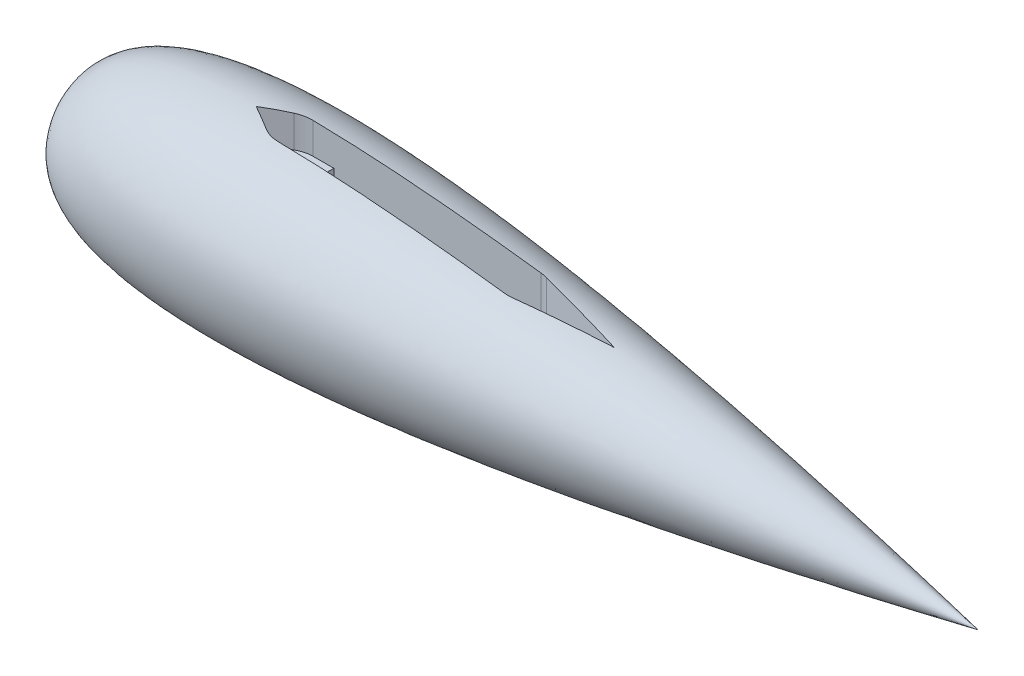
ISO-10303-21;
HEADER;
FILE_DESCRIPTION(('STEP AP214'),'2;1');
FILE_NAME('part.step','',(''),(''),'','','');
FILE_SCHEMA(('AUTOMOTIVE_DESIGN { 1 0 10303 214 1 1 1 1 }'));
ENDSEC;
DATA;
#1=APPLICATION_CONTEXT('core data for automotive mechanical design processes');
#2=APPLICATION_PROTOCOL_DEFINITION('international standard','automotive_design',2000,#1);
#3=PRODUCT_CONTEXT('',#1,'mechanical');
#4=PRODUCT('Part','Part','',(#3));
#5=PRODUCT_RELATED_PRODUCT_CATEGORY('part','',(#4));
#6=PRODUCT_DEFINITION_FORMATION('','',#4);
#7=PRODUCT_DEFINITION_CONTEXT('part definition',#1,'design');
#8=PRODUCT_DEFINITION('design','',#6,#7);
#9=PRODUCT_DEFINITION_SHAPE('','',#8);
#10=(LENGTH_UNIT() NAMED_UNIT(*) SI_UNIT(.MILLI.,.METRE.));
#11=(NAMED_UNIT(*) PLANE_ANGLE_UNIT() SI_UNIT($,.RADIAN.));
#12=(NAMED_UNIT(*) SI_UNIT($,.STERADIAN.) SOLID_ANGLE_UNIT());
#13=UNCERTAINTY_MEASURE_WITH_UNIT(LENGTH_MEASURE(1.E-05),#10,'distance_accuracy_value','');
#14=(GEOMETRIC_REPRESENTATION_CONTEXT(3) GLOBAL_UNCERTAINTY_ASSIGNED_CONTEXT((#13)) GLOBAL_UNIT_ASSIGNED_CONTEXT((#10,
#11,#12)) REPRESENTATION_CONTEXT('',''));
#15=CARTESIAN_POINT('',(0.,0.,0.));
#16=DIRECTION('',(0.,0.,1.));
#17=DIRECTION('',(1.,0.,0.));
#18=AXIS2_PLACEMENT_3D('',#15,#16,#17);
#19=CARTESIAN_POINT('',(55.6564205666341,0.,0.));
#20=CARTESIAN_POINT('',(-94.3435794333659,29.0957116563533,0.));
#21=CARTESIAN_POINT('',(-94.3435794333659,10.223622887628,0.));
#22=CARTESIAN_POINT('',(-94.3435794333659,0.,0.));
#23=B_SPLINE_CURVE_WITH_KNOTS('',3,(#19,#20,#21,#22),.UNSPECIFIED.,.F.,.F.,(4,4),(0.,1.),.UNSPECIFIED.);
#24=CARTESIAN_POINT('',(-94.3435794333659,0.,0.));
#25=DIRECTION('',(-1.,0.,0.));
#26=AXIS1_PLACEMENT('',#24,#25);
#27=SURFACE_OF_REVOLUTION('',#23,#26);
#28=CARTESIAN_POINT('',(-65.2373916220375,15.4666818521613,0.));
#29=CARTESIAN_POINT('',(-65.0690509804965,15.4709053824852,0.0971915147092756));
#30=CARTESIAN_POINT('',(-64.9006877576788,15.4739192362829,0.194396066724708));
#31=CARTESIAN_POINT('',(-64.5640175159769,15.4775415760858,0.388772721399423));
#32=CARTESIAN_POINT('',(-64.3957105058185,15.4781511419781,0.485944819020868));
#33=CARTESIAN_POINT('',(-64.0591527461173,15.4769828320744,0.680256532182195));
#34=CARTESIAN_POINT('',(-63.8909019947082,15.475205665124,0.777396148799607));
#35=CARTESIAN_POINT('',(-63.5544566714715,15.4692774266519,0.971642946737914));
#36=CARTESIAN_POINT('',(-63.3862620950196,15.4651267047136,1.06875013072865));
#37=CARTESIAN_POINT('',(-63.0499298127876,15.4544614114961,1.26293166441246));
#38=CARTESIAN_POINT('',(-62.8817921067995,15.4479468489571,1.36000601422561));
#39=CARTESIAN_POINT('',(-62.5455723394431,15.432560165854,1.55412258741567));
#40=CARTESIAN_POINT('',(-62.3774902902281,15.4236876912814,1.6511648037759));
#41=CARTESIAN_POINT('',(-62.0413816848923,15.4035880418934,1.84521719754349));
#42=CARTESIAN_POINT('',(-61.8733551601594,15.3923601673027,1.94222735682901));
#43=CARTESIAN_POINT('',(-61.5373576375626,15.3675483800647,2.13621561694731));
#44=CARTESIAN_POINT('',(-61.3693866975708,15.353963422472,2.23319368436761));
#45=CARTESIAN_POINT('',(-61.2014932371752,15.339203451421,2.33012701892221));
#46=B_SPLINE_CURVE_WITH_KNOTS('',3,(#28,#29,#30,#31,#32,#33,#34,#35,#36,#37,#38,#39,#40,#41,#42,
#43,#44,#45),.UNSPECIFIED.,.F.,.F.,(4,2,2,2,2,2,2,2,4),(0.,0.583282651433663,1.16630329134126,
1.74915081583197,2.33191251911513,2.9146720677068,3.4975191591856,4.08053965686277,
4.66381928350256),.UNSPECIFIED.);
#47=CARTESIAN_POINT('',(-65.2373916220375,15.4666818521613,0.));
#48=VERTEX_POINT('',#47);
#49=CARTESIAN_POINT('',(-61.2014932371752,15.339203451421,2.33012701892221));
#50=VERTEX_POINT('',#49);
#51=EDGE_CURVE('E178',#48,#50,#46,.T.);
#52=ORIENTED_EDGE('',*,*,#51,.F.);
#53=CARTESIAN_POINT('',(-65.2373916220375,15.4666818521613,0.));
#54=CARTESIAN_POINT('',(-65.0690509804965,15.4709053824852,-0.0971915147092773));
#55=CARTESIAN_POINT('',(-64.9006877576788,15.4739192362829,-0.19439606672471));
#56=CARTESIAN_POINT('',(-64.5640175159769,15.4775415760858,-0.388772721399423));
#57=CARTESIAN_POINT('',(-64.3957105058185,15.4781511419781,-0.485944819020869));
#58=CARTESIAN_POINT('',(-64.0591527461173,15.4769828320744,-0.680256532182196));
#59=CARTESIAN_POINT('',(-63.8909019947082,15.475205665124,-0.777396148799607));
#60=CARTESIAN_POINT('',(-63.5544566714715,15.4692774266519,-0.971642946737915));
#61=CARTESIAN_POINT('',(-63.3862620950196,15.4651267047136,-1.06875013072865));
#62=CARTESIAN_POINT('',(-63.0499298127876,15.4544614114961,-1.26293166441246));
#63=CARTESIAN_POINT('',(-62.8817921067995,15.4479468489571,-1.36000601422561));
#64=CARTESIAN_POINT('',(-62.5455723394431,15.432560165854,-1.55412258741568));
#65=CARTESIAN_POINT('',(-62.3774902902281,15.4236876912814,-1.6511648037759));
#66=CARTESIAN_POINT('',(-62.0413816848923,15.4035880418934,-1.8452171975435));
#67=CARTESIAN_POINT('',(-61.8733551601594,15.3923601673027,-1.94222735682902));
#68=CARTESIAN_POINT('',(-61.5373576375626,15.3675483800647,-2.13621561694732));
#69=CARTESIAN_POINT('',(-61.3693866975708,15.353963422472,-2.23319368436762));
#70=CARTESIAN_POINT('',(-61.2014932371752,15.339203451421,-2.33012701892222));
#71=B_SPLINE_CURVE_WITH_KNOTS('',3,(#53,#54,#55,#56,#57,#58,#59,#60,#61,#62,#63,#64,#65,#66,#67,
#68,#69,#70),.UNSPECIFIED.,.F.,.F.,(4,2,2,2,2,2,2,2,4),(0.,0.583282651433662,1.16630329134125,
1.74915081583196,2.33191251911513,2.9146720677068,3.4975191591856,4.08053965686277,
4.66381928350256),.UNSPECIFIED.);
#72=CARTESIAN_POINT('',(-61.2014932371752,15.339203451421,-2.33012701892221));
#73=VERTEX_POINT('',#72);
#74=EDGE_CURVE('E11',#48,#73,#71,.T.);
#75=ORIENTED_EDGE('',*,*,#74,.T.);
#76=CARTESIAN_POINT('',(-61.2014932371752,15.339203451421,-2.33012701892221));
#77=CARTESIAN_POINT('',(-61.0793496460925,15.3284560416102,-2.40066262383545));
#78=CARTESIAN_POINT('',(-60.9541949867266,15.3178823924373,-2.46601366170608));
#79=CARTESIAN_POINT('',(-60.6987169665933,15.2974942002791,-2.58595482031964));
#80=CARTESIAN_POINT('',(-60.5683917647922,15.2876799314173,-2.64054106606606));
#81=CARTESIAN_POINT('',(-60.306391933304,15.2694307817743,-2.73744555706165));
#82=CARTESIAN_POINT('',(-60.174808106324,15.2609705691354,-2.78000452746559));
#83=CARTESIAN_POINT('',(-59.908547977557,15.2454989264825,-2.85408176842758));
#84=CARTESIAN_POINT('',(-59.7738730084066,15.238486884708,-2.88560470493815));
#85=CARTESIAN_POINT('',(-59.4848765656973,15.2253794755396,-2.94070955522845));
#86=CARTESIAN_POINT('',(-59.330249293477,15.2195167732993,-2.9627559159899));
#87=CARTESIAN_POINT('',(-59.0175976120412,15.2101216169428,-2.9925062303323));
#88=CARTESIAN_POINT('',(-58.859554902197,15.2066192231815,-3.00002736162957));
#89=CARTESIAN_POINT('',(-58.7014932371752,15.20445396479,-3.));
#90=B_SPLINE_CURVE_WITH_KNOTS('',3,(#76,#77,#78,#79,#80,#81,#82,#83,#84,#85,#86,#87,#88,#89),
.UNSPECIFIED.,.F.,.F.,(4,2,2,2,2,2,4),(0.,0.424245987886247,0.848644413730668,1.26382423233642,
1.67882830343421,2.14702105168672,2.62106927269348),.UNSPECIFIED.);
#91=CARTESIAN_POINT('',(-58.7014932371752,15.20445396479,-3.));
#92=VERTEX_POINT('',#91);
#93=EDGE_CURVE('E46',#73,#92,#90,.T.);
#94=ORIENTED_EDGE('',*,*,#93,.T.);
#95=CARTESIAN_POINT('',(-58.7014932371752,15.20445396479,-3.));
#96=CARTESIAN_POINT('',(-58.0870352920107,15.1959248918525,-3.));
#97=CARTESIAN_POINT('',(-57.4726217185503,15.1844913130048,-3.));
#98=CARTESIAN_POINT('',(-56.2439262759059,15.1562159738541,-3.));
#99=CARTESIAN_POINT('',(-55.6296444051429,15.13937428249,-3.));
#100=CARTESIAN_POINT('',(-54.401413902033,15.1006887988245,-3.));
#101=CARTESIAN_POINT('',(-53.7874652245871,15.0788464268982,-3.));
#102=CARTESIAN_POINT('',(-52.5597508867958,15.0304974135428,-3.));
#103=CARTESIAN_POINT('',(-51.9459852271191,15.0039907552778,-3.));
#104=CARTESIAN_POINT('',(-50.1051329977693,14.9179523587953,-3.));
#105=CARTESIAN_POINT('',(-48.878347548352,14.8518975251186,-3.));
#106=CARTESIAN_POINT('',(-46.4257248088282,14.7044903698753,-3.));
#107=CARTESIAN_POINT('',(-45.199887507067,14.6231382394432,-3.));
#108=CARTESIAN_POINT('',(-42.7502977665029,14.4469041617806,-3.));
#109=CARTESIAN_POINT('',(-41.5265444441324,14.3520344437495,-3.));
#110=CARTESIAN_POINT('',(-39.0799845429357,14.1500977722042,-3.));
#111=CARTESIAN_POINT('',(-37.8571780170402,14.0430301802551,-3.));
#112=CARTESIAN_POINT('',(-35.4125505672201,13.8178568269435,-3.));
#113=CARTESIAN_POINT('',(-34.1907296719285,13.6997507557861,-3.));
#114=CARTESIAN_POINT('',(-31.7481276467807,13.4534785493532,-3.));
#115=CARTESIAN_POINT('',(-30.5273464967265,13.3253126142241,-3.));
#116=CARTESIAN_POINT('',(-28.8197456059356,13.1394951941399,-3.));
#117=CARTESIAN_POINT('',(-28.3324999395995,13.0857282877695,-3.));
#118=CARTESIAN_POINT('',(-27.3581797000329,12.9767666677396,-3.));
#119=CARTESIAN_POINT('',(-26.8711051230219,12.9215719879407,-3.));
#120=CARTESIAN_POINT('',(-25.8971205689243,12.8097981990909,-3.));
#121=CARTESIAN_POINT('',(-25.4102105900329,12.7532191057553,-3.));
#122=CARTESIAN_POINT('',(-24.436416303427,12.6387009264035,-3.));
#123=CARTESIAN_POINT('',(-23.9495320387334,12.5807614745876,-3.));
#124=CARTESIAN_POINT('',(-22.9759151998118,12.4635750462434,-3.));
#125=CARTESIAN_POINT('',(-22.4891826274115,12.4043280545351,-3.));
#126=CARTESIAN_POINT('',(-21.5158630969688,12.2845609933296,-3.));
#127=CARTESIAN_POINT('',(-21.0292761424176,12.2240408954569,-3.));
#128=CARTESIAN_POINT('',(-20.5427669895837,12.1629024659419,-3.));
#129=B_SPLINE_CURVE_WITH_KNOTS('',3,(#95,#96,#97,#98,#99,#100,#101,#102,#103,#104,#105,#106,
#107,#108,#109,#110,#111,#112,#113,#114,#115,#116,#117,#118,#119,#120,#121,#122,#123,#124,#125,
#126,#127,#128),.UNSPECIFIED.,.F.,.F.,(4,2,2,2,2,2,2,2,2,2,2,2,2,2,2,2,4),(0.,1.84353856453014,
3.68705362977902,5.53004571790475,7.37304445852828,11.0586108648056,14.7441312242561,
18.4263382617576,22.1087381140673,25.7912413439782,29.4736713270844,30.9442796213498,
32.414853070978,33.8854098350295,35.3563666653598,36.827340581703,38.2983473183874),.UNSPECIFIED.);
#130=CARTESIAN_POINT('',(-20.5427669895838,12.1629024659419,-3.));
#131=VERTEX_POINT('',#130);
#132=EDGE_CURVE('E342',#92,#131,#129,.T.);
#133=ORIENTED_EDGE('',*,*,#132,.T.);
#134=CARTESIAN_POINT('',(-20.5427669895838,12.1629024659419,-3.));
#135=CARTESIAN_POINT('',(-20.4872663636176,12.1559272151695,-3.00000043079705));
#136=CARTESIAN_POINT('',(-20.4317382521148,12.1491693807532,-2.99907591645263));
#137=CARTESIAN_POINT('',(-20.3208204440363,12.1361114158474,-2.9953789202456));
#138=CARTESIAN_POINT('',(-20.2654307250515,12.1298102604338,-2.99261072814311));
#139=CARTESIAN_POINT('',(-20.154789653964,12.1176631948095,-2.98523261683951));
#140=CARTESIAN_POINT('',(-20.0995382158315,12.1118167623807,-2.98062484872597));
#141=CARTESIAN_POINT('',(-19.9891735145613,12.1005745802622,-2.96956838579857));
#142=CARTESIAN_POINT('',(-19.9340602521902,12.0951788330681,-2.96311968079204));
#143=CARTESIAN_POINT('',(-19.8239734878524,12.0848328978099,-2.948375822842));
#144=CARTESIAN_POINT('',(-19.7690002226369,12.079883234657,-2.9400785334892));
#145=CARTESIAN_POINT('',(-19.6591956416443,12.0704221859669,-2.92162671436415));
#146=CARTESIAN_POINT('',(-19.6043649554257,12.065911848919,-2.91146790056748));
#147=CARTESIAN_POINT('',(-19.5497028311302,12.0616255324515,-2.90039014540629));
#148=B_SPLINE_CURVE_WITH_KNOTS('',3,(#134,#135,#136,#137,#138,#139,#140,#141,#142,#143,#144,
#145,#146,#147),.UNSPECIFIED.,.F.,.F.,(4,2,2,2,2,2,4),(0.,0.167803843883221,0.335218609390303,
0.50243818103265,0.669658678534593,0.837073444630842,1.00487844357633),.UNSPECIFIED.);
#149=CARTESIAN_POINT('',(-19.5497028311302,12.0616255324515,-2.90039014540629));
#150=VERTEX_POINT('',#149);
#151=EDGE_CURVE('E335',#131,#150,#148,.T.);
#152=ORIENTED_EDGE('',*,*,#151,.T.);
#153=CARTESIAN_POINT('',(-19.5497028311302,12.0616255324515,-2.90039014540628));
#154=CARTESIAN_POINT('',(-19.0710758732606,12.024087389661,-2.80339638306769));
#155=CARTESIAN_POINT('',(-18.5925594896721,11.9850808618358,-2.70642502860931));
#156=CARTESIAN_POINT('',(-17.6358393400211,11.9041308590571,-2.51254567164029));
#157=CARTESIAN_POINT('',(-17.1576355372563,11.8621878356743,-2.41563766169192));
#158=CARTESIAN_POINT('',(-16.2015411092934,11.7753582331201,-2.2218851072352));
#159=CARTESIAN_POINT('',(-15.7236504539784,11.7304719992325,-2.12504055662363));
#160=CARTESIAN_POINT('',(-14.768183985538,11.6377371246185,-1.93141525817638));
#161=CARTESIAN_POINT('',(-14.2906081502129,11.5898887220563,-1.8346345058419));
#162=CARTESIAN_POINT('',(-13.33577385747,11.4912009279327,-1.64113731781205));
#163=CARTESIAN_POINT('',(-12.858515387422,11.4403616636219,-1.54442087955716));
#164=CARTESIAN_POINT('',(-11.9043131913195,11.3356515747716,-1.35105178592381));
#165=CARTESIAN_POINT('',(-11.4273694683833,11.2817807206411,-1.25439913117727));
#166=CARTESIAN_POINT('',(-10.4738084176264,11.1709563488975,-1.0611599656607));
#167=CARTESIAN_POINT('',(-9.99719110234488,11.1140027189212,-0.964573457431728));
#168=CARTESIAN_POINT('',(-9.04429074544584,10.996947685577,-0.771468181538323));
#169=CARTESIAN_POINT('',(-8.5680077322296,10.936846041429,-0.674949419629404));
#170=CARTESIAN_POINT('',(-7.61578529671361,10.8134165606309,-0.481981524517483));
#171=CARTESIAN_POINT('',(-7.1398459222766,10.7500883392936,-0.385532401013871));
#172=CARTESIAN_POINT('',(-6.1883232345637,10.620106196933,-0.192706309807883));
#173=CARTESIAN_POINT('',(-5.71273999356087,10.5534517252549,-0.0963293567516443));
#174=CARTESIAN_POINT('',(-5.23739162203752,10.4850915672217,0.));
#175=B_SPLINE_CURVE_WITH_KNOTS('',3,(#153,#154,#155,#156,#157,#158,#159,#160,#161,#162,#163,
#164,#165,#166,#167,#168,#169,#170,#171,#172,#173,#174),.UNSPECIFIED.,.F.,.F.,(4,2,2,2,2,2,2,2,
2,2,4),(0.,1.4693875229113,2.93854957939988,4.40753958798804,5.87641163992007,7.3452212416401,
8.81404518272708,10.2829226966598,11.7519127241806,13.2210783030917,14.6904879118444),.UNSPECIFIED.);
#176=CARTESIAN_POINT('',(-5.23739162203752,10.4850915672217,0.));
#177=VERTEX_POINT('',#176);
#178=EDGE_CURVE('E343',#150,#177,#175,.T.);
#179=ORIENTED_EDGE('',*,*,#178,.T.);
#180=CARTESIAN_POINT('',(-19.5497028311302,12.0616255324515,2.90039014540629));
#181=CARTESIAN_POINT('',(-19.0710758732606,12.024087389661,2.80339638306769));
#182=CARTESIAN_POINT('',(-18.5925594896721,11.9850808618358,2.70642502860931));
#183=CARTESIAN_POINT('',(-17.6358393400211,11.9041308590571,2.51254567164029));
#184=CARTESIAN_POINT('',(-17.1576355372563,11.8621878356743,2.41563766169192));
#185=CARTESIAN_POINT('',(-16.2015411092935,11.7753582331201,2.2218851072352));
#186=CARTESIAN_POINT('',(-15.7236504539784,11.7304719992325,2.12504055662363));
#187=CARTESIAN_POINT('',(-14.7681839855381,11.6377371246185,1.93141525817638));
#188=CARTESIAN_POINT('',(-14.2906081502129,11.5898887220563,1.8346345058419));
#189=CARTESIAN_POINT('',(-13.33577385747,11.4912009279327,1.64113731781205));
#190=CARTESIAN_POINT('',(-12.858515387422,11.4403616636219,1.54442087955716));
#191=CARTESIAN_POINT('',(-11.9043131913195,11.3356515747716,1.35105178592381));
#192=CARTESIAN_POINT('',(-11.4273694683833,11.2817807206411,1.25439913117727));
#193=CARTESIAN_POINT('',(-10.4738084176264,11.1709563488975,1.0611599656607));
#194=CARTESIAN_POINT('',(-9.99719110234488,11.1140027189212,0.964573457431728));
#195=CARTESIAN_POINT('',(-9.04429074544584,10.996947685577,0.771468181538324));
#196=CARTESIAN_POINT('',(-8.56800773222961,10.936846041429,0.674949419629405));
#197=CARTESIAN_POINT('',(-7.61578529671361,10.8134165606309,0.481981524517484));
#198=CARTESIAN_POINT('',(-7.1398459222766,10.7500883392936,0.385532401013871));
#199=CARTESIAN_POINT('',(-6.1883232345637,10.620106196933,0.192706309807883));
#200=CARTESIAN_POINT('',(-5.71273999356087,10.5534517252549,0.0963293567516439));
#201=CARTESIAN_POINT('',(-5.23739162203752,10.4850915672217,0.));
#202=B_SPLINE_CURVE_WITH_KNOTS('',3,(#180,#181,#182,#183,#184,#185,#186,#187,#188,#189,#190,
#191,#192,#193,#194,#195,#196,#197,#198,#199,#200,#201),.UNSPECIFIED.,.F.,.F.,(4,2,2,2,2,2,2,2,
2,2,4),(0.,1.4693875229113,2.93854957939989,4.40753958798804,5.87641163992007,7.3452212416401,
8.81404518272708,10.2829226966598,11.7519127241806,13.2210783030917,14.6904879118444),.UNSPECIFIED.);
#203=CARTESIAN_POINT('',(-19.5497028311302,12.0616255324515,2.90039014540629));
#204=VERTEX_POINT('',#203);
#205=EDGE_CURVE('E306',#204,#177,#202,.T.);
#206=ORIENTED_EDGE('',*,*,#205,.F.);
#207=CARTESIAN_POINT('',(-19.5497028311302,12.0616255324515,2.90039014540629));
#208=CARTESIAN_POINT('',(-19.6043649554257,12.065911848919,2.91146790056748));
#209=CARTESIAN_POINT('',(-19.6591956416443,12.0704221859669,2.92162671436415));
#210=CARTESIAN_POINT('',(-19.7690002226369,12.079883234657,2.9400785334892));
#211=CARTESIAN_POINT('',(-19.8239734878524,12.0848328978099,2.948375822842));
#212=CARTESIAN_POINT('',(-19.9340602521902,12.0951788330681,2.96311968079204));
#213=CARTESIAN_POINT('',(-19.9891735145613,12.1005745802622,2.96956838579857));
#214=CARTESIAN_POINT('',(-20.0995382158315,12.1118167623807,2.98062484872597));
#215=CARTESIAN_POINT('',(-20.154789653964,12.1176631948095,2.98523261683951));
#216=CARTESIAN_POINT('',(-20.2654307250515,12.1298102604338,2.99261072814311));
#217=CARTESIAN_POINT('',(-20.3208204440363,12.1361114158474,2.9953789202456));
#218=CARTESIAN_POINT('',(-20.4317382521148,12.1491693807532,2.99907591645263));
#219=CARTESIAN_POINT('',(-20.4872663636176,12.1559272151695,3.00000043079705));
#220=CARTESIAN_POINT('',(-20.5427669895838,12.1629024659419,3.));
#221=B_SPLINE_CURVE_WITH_KNOTS('',3,(#207,#208,#209,#210,#211,#212,#213,#214,#215,#216,#217,
#218,#219,#220),.UNSPECIFIED.,.F.,.F.,(4,2,2,2,2,2,4),(0.,0.167804998945487,0.335219765041739,
0.502440262543678,0.669659834186026,0.837074599693111,1.00487844357633),.UNSPECIFIED.);
#222=CARTESIAN_POINT('',(-20.5427669895838,12.1629024659419,3.));
#223=VERTEX_POINT('',#222);
#224=EDGE_CURVE('E298',#204,#223,#221,.T.);
#225=ORIENTED_EDGE('',*,*,#224,.T.);
#226=CARTESIAN_POINT('',(-58.7014932371752,15.20445396479,3.));
#227=CARTESIAN_POINT('',(-58.0870352920107,15.1959248918525,3.));
#228=CARTESIAN_POINT('',(-57.4726217185503,15.1844913130048,3.));
#229=CARTESIAN_POINT('',(-56.2439262759059,15.1562159738541,3.));
#230=CARTESIAN_POINT('',(-55.6296444051429,15.13937428249,3.));
#231=CARTESIAN_POINT('',(-54.401413902033,15.1006887988245,3.));
#232=CARTESIAN_POINT('',(-53.7874652245871,15.0788464268982,3.));
#233=CARTESIAN_POINT('',(-52.5597508867958,15.0304974135428,3.));
#234=CARTESIAN_POINT('',(-51.9459852271191,15.0039907552778,3.));
#235=CARTESIAN_POINT('',(-50.1051329977693,14.9179523587953,3.));
#236=CARTESIAN_POINT('',(-48.878347548352,14.8518975251186,3.));
#237=CARTESIAN_POINT('',(-46.4257248088282,14.7044903698753,3.));
#238=CARTESIAN_POINT('',(-45.199887507067,14.6231382394432,3.));
#239=CARTESIAN_POINT('',(-42.7502977665029,14.4469041617806,3.));
#240=CARTESIAN_POINT('',(-41.5265444441324,14.3520344437495,3.));
#241=CARTESIAN_POINT('',(-39.0799845429357,14.1500977722042,3.));
#242=CARTESIAN_POINT('',(-37.8571780170402,14.0430301802551,3.));
#243=CARTESIAN_POINT('',(-35.4125505672201,13.8178568269435,3.));
#244=CARTESIAN_POINT('',(-34.1907296719285,13.6997507557861,3.));
#245=CARTESIAN_POINT('',(-31.7481276467807,13.4534785493532,3.));
#246=CARTESIAN_POINT('',(-30.5273464967265,13.3253126142241,3.));
#247=CARTESIAN_POINT('',(-28.8197456059356,13.1394951941399,3.));
#248=CARTESIAN_POINT('',(-28.3324999395995,13.0857282877695,3.));
#249=CARTESIAN_POINT('',(-27.3581797000329,12.9767666677396,3.));
#250=CARTESIAN_POINT('',(-26.8711051230219,12.9215719879407,3.));
#251=CARTESIAN_POINT('',(-25.8971205689243,12.8097981990909,3.));
#252=CARTESIAN_POINT('',(-25.4102105900329,12.7532191057553,3.));
#253=CARTESIAN_POINT('',(-24.436416303427,12.6387009264035,3.));
#254=CARTESIAN_POINT('',(-23.9495320387334,12.5807614745876,3.));
#255=CARTESIAN_POINT('',(-22.9759151998119,12.4635750462434,3.));
#256=CARTESIAN_POINT('',(-22.4891826274115,12.4043280545351,3.));
#257=CARTESIAN_POINT('',(-21.5158630969688,12.2845609933296,3.));
#258=CARTESIAN_POINT('',(-21.0292761424176,12.2240408954569,3.));
#259=CARTESIAN_POINT('',(-20.5427669895838,12.1629024659419,3.));
#260=B_SPLINE_CURVE_WITH_KNOTS('',3,(#226,#227,#228,#229,#230,#231,#232,#233,#234,#235,#236,
#237,#238,#239,#240,#241,#242,#243,#244,#245,#246,#247,#248,#249,#250,#251,#252,#253,#254,#255,
#256,#257,#258,#259),.UNSPECIFIED.,.F.,.F.,(4,2,2,2,2,2,2,2,2,2,2,2,2,2,2,2,4),(0.,
1.84353856453014,3.68705362977902,5.53004571790475,7.37304445852828,11.0586108648056,
14.7441312242561,18.4263382617576,22.1087381140673,25.7912413439782,29.4736713270844,
30.9442796213498,32.414853070978,33.8854098350295,35.3563666653598,36.827340581703,
38.2983473183874),.UNSPECIFIED.);
#261=CARTESIAN_POINT('',(-58.7014932371752,15.20445396479,3.));
#262=VERTEX_POINT('',#261);
#263=EDGE_CURVE('E292',#262,#223,#260,.T.);
#264=ORIENTED_EDGE('',*,*,#263,.F.);
#265=CARTESIAN_POINT('',(-58.7014932371752,15.20445396479,3.));
#266=CARTESIAN_POINT('',(-58.8429335018249,15.2063981755608,3.00001680161659));
#267=CARTESIAN_POINT('',(-58.9843547099245,15.2094047730796,2.99399909440208));
#268=CARTESIAN_POINT('',(-59.2661528742182,15.217396258166,2.97002157759625));
#269=CARTESIAN_POINT('',(-59.4065296260198,15.2223815230832,2.95205948966266));
#270=CARTESIAN_POINT('',(-59.6821706161598,15.2340556357507,2.90483545280026));
#271=CARTESIAN_POINT('',(-59.8174798045295,15.2407053883076,2.87582578429401));
#272=CARTESIAN_POINT('',(-60.0850994197224,15.2555108433292,2.80673772365909));
#273=CARTESIAN_POINT('',(-60.217410942197,15.2636659852668,2.76666344865808));
#274=CARTESIAN_POINT('',(-60.494949606398,15.2823086661108,2.66988007373032));
#275=CARTESIAN_POINT('',(-60.6396531203211,15.2929612416825,2.61169555910155));
#276=CARTESIAN_POINT('',(-60.9247110971269,15.3153945618362,2.48132047331661));
#277=CARTESIAN_POINT('',(-61.0649889680911,15.3271877027724,2.40896451893234));
#278=CARTESIAN_POINT('',(-61.2014932371752,15.339203451421,2.33012701892221));
#279=B_SPLINE_CURVE_WITH_KNOTS('',3,(#265,#266,#267,#268,#269,#270,#271,#272,#273,#274,#275,
#276,#277,#278),.UNSPECIFIED.,.F.,.F.,(4,2,2,2,2,2,4),(0.,0.424223099021623,0.848527140102359,
1.26367243204875,1.67866345659933,2.14695176824721,2.6210712602232),.UNSPECIFIED.);
#280=EDGE_CURVE('E269',#262,#50,#279,.T.);
#281=ORIENTED_EDGE('',*,*,#280,.T.);
#282=EDGE_LOOP('',(#52,#75,#94,#133,#152,#179,#206,#225,#264,#281));
#283=FACE_BOUND('',#282,.T.);
#284=CARTESIAN_POINT('',(-94.3435794333659,0.,0.));
#285=VERTEX_POINT('',#284);
#286=VERTEX_LOOP('',#285);
#287=FACE_BOUND('',#286,.T.);
#288=CARTESIAN_POINT('',(55.6564205666341,0.,0.));
#289=VERTEX_POINT('',#288);
#290=VERTEX_LOOP('',#289);
#291=FACE_BOUND('',#290,.T.);
#292=ADVANCED_FACE('F32',(#283,#287,#291),#27,.T.);
#293=CARTESIAN_POINT('',(-65.2373916220375,0.,0.));
#294=DIRECTION('',(-0.499999999999995,0.,-0.866025403784442));
#295=DIRECTION('',(-0.866025403784442,0.,0.499999999999995));
#296=AXIS2_PLACEMENT_3D('',#293,#294,#295);
#297=PLANE('',#296);
#298=DIRECTION('',(0.,1.,0.));
#299=VECTOR('',#298,1.);
#300=CARTESIAN_POINT('',(-65.2373916220375,0.,0.));
#301=LINE('',#300,#299);
#302=CARTESIAN_POINT('',(-65.2373916220375,10.,0.));
#303=VERTEX_POINT('',#302);
#304=EDGE_CURVE('E53',#303,#48,#301,.T.);
#305=ORIENTED_EDGE('',*,*,#304,.F.);
#306=DIRECTION('',(-0.866025403784442,0.,0.499999999999995));
#307=VECTOR('',#306,1.);
#308=CARTESIAN_POINT('',(-57.7378246347394,10.,-4.32987701892216));
#309=LINE('',#308,#307);
#310=CARTESIAN_POINT('',(-61.2014932371752,10.,-2.33012701892221));
#311=VERTEX_POINT('',#310);
#312=EDGE_CURVE('E177',#311,#303,#309,.T.);
#313=ORIENTED_EDGE('',*,*,#312,.F.);
#314=DIRECTION('',(0.,1.,0.));
#315=VECTOR('',#314,1.);
#316=CARTESIAN_POINT('',(-61.2014932371752,0.,-2.33012701892221));
#317=LINE('',#316,#315);
#318=EDGE_CURVE('E401',#73,#311,#317,.F.);
#319=ORIENTED_EDGE('',*,*,#318,.F.);
#320=ORIENTED_EDGE('',*,*,#74,.F.);
#321=EDGE_LOOP('',(#305,#313,#319,#320));
#322=FACE_BOUND('',#321,.T.);
#323=ADVANCED_FACE('F367',(#322),#297,.F.);
#324=CARTESIAN_POINT('',(-58.7014932371752,0.,2.));
#325=DIRECTION('',(0.,1.,0.));
#326=DIRECTION('',(-1.,0.,0.));
#327=AXIS2_PLACEMENT_3D('',#324,#325,#326);
#328=CYLINDRICAL_SURFACE('',#327,5.);
#329=ORIENTED_EDGE('',*,*,#318,.T.);
#330=CARTESIAN_POINT('',(-58.7014932371752,10.,2.));
#331=DIRECTION('',(0.,1.,0.));
#332=DIRECTION('',(-1.,0.,0.));
#333=AXIS2_PLACEMENT_3D('',#330,#331,#332);
#334=CIRCLE('',#333,5.);
#335=CARTESIAN_POINT('',(-58.7014932371752,10.,-3.));
#336=VERTEX_POINT('',#335);
#337=EDGE_CURVE('E399',#311,#336,#334,.F.);
#338=ORIENTED_EDGE('',*,*,#337,.T.);
#339=DIRECTION('',(0.,1.,0.));
#340=VECTOR('',#339,1.);
#341=CARTESIAN_POINT('',(-58.7014932371752,0.,-3.));
#342=LINE('',#341,#340);
#343=EDGE_CURVE('E398',#336,#92,#342,.T.);
#344=ORIENTED_EDGE('',*,*,#343,.T.);
#345=ORIENTED_EDGE('',*,*,#93,.F.);
#346=EDGE_LOOP('',(#329,#338,#344,#345));
#347=FACE_BOUND('',#346,.T.);
#348=ADVANCED_FACE('F331',(#347),#328,.F.);
#349=CARTESIAN_POINT('',(-60.0412391993308,0.,-3.));
#350=DIRECTION('',(0.,0.,-1.));
#351=DIRECTION('',(-1.,0.,0.));
#352=AXIS2_PLACEMENT_3D('',#349,#350,#351);
#353=PLANE('',#352);
#354=ORIENTED_EDGE('',*,*,#343,.F.);
#355=DIRECTION('',(1.,0.,0.));
#356=VECTOR('',#355,1.);
#357=CARTESIAN_POINT('',(-55.2373916220375,10.,-3.));
#358=LINE('',#357,#356);
#359=CARTESIAN_POINT('',(-55.2373916220375,10.,-3.));
#360=VERTEX_POINT('',#359);
#361=EDGE_CURVE('E227',#336,#360,#358,.T.);
#362=ORIENTED_EDGE('',*,*,#361,.T.);
#363=DIRECTION('',(0.,-1.,0.));
#364=VECTOR('',#363,1.);
#365=CARTESIAN_POINT('',(-55.2373916220375,5.,-3.));
#366=LINE('',#365,#364);
#367=CARTESIAN_POINT('',(-55.2373916220375,5.,-3.));
#368=VERTEX_POINT('',#367);
#369=EDGE_CURVE('E234',#360,#368,#366,.T.);
#370=ORIENTED_EDGE('',*,*,#369,.T.);
#371=DIRECTION('',(-1.,0.,0.));
#372=VECTOR('',#371,1.);
#373=CARTESIAN_POINT('',(-65.2373916220375,5.,-3.));
#374=LINE('',#373,#372);
#375=CARTESIAN_POINT('',(-58.7014932371752,5.,-3.));
#376=VERTEX_POINT('',#375);
#377=EDGE_CURVE('E231',#368,#376,#374,.T.);
#378=ORIENTED_EDGE('',*,*,#377,.T.);
#379=DIRECTION('',(0.,1.,0.));
#380=VECTOR('',#379,1.);
#381=CARTESIAN_POINT('',(-58.7014932371752,0.,-3.));
#382=LINE('',#381,#380);
#383=CARTESIAN_POINT('',(-58.7014932371752,0.,-3.));
#384=VERTEX_POINT('',#383);
#385=EDGE_CURVE('E414',#384,#376,#382,.T.);
#386=ORIENTED_EDGE('',*,*,#385,.F.);
#387=DIRECTION('',(-1.,0.,0.));
#388=VECTOR('',#387,1.);
#389=CARTESIAN_POINT('',(-60.0412391993308,0.,-3.));
#390=LINE('',#389,#388);
#391=CARTESIAN_POINT('',(-20.5427669895838,0.,-3.));
#392=VERTEX_POINT('',#391);
#393=EDGE_CURVE('E217',#392,#384,#390,.T.);
#394=ORIENTED_EDGE('',*,*,#393,.F.);
#395=DIRECTION('',(0.,1.,0.));
#396=VECTOR('',#395,1.);
#397=CARTESIAN_POINT('',(-20.5427669895838,0.,-3.));
#398=LINE('',#397,#396);
#399=EDGE_CURVE('E211',#131,#392,#398,.F.);
#400=ORIENTED_EDGE('',*,*,#399,.F.);
#401=ORIENTED_EDGE('',*,*,#132,.F.);
#402=EDGE_LOOP('',(#354,#362,#370,#378,#386,#394,#400,#401));
#403=FACE_BOUND('',#402,.T.);
#404=ADVANCED_FACE('F329',(#403),#353,.F.);
#405=CARTESIAN_POINT('',(-20.5427669895838,0.,1.99999999999999));
#406=DIRECTION('',(0.,1.,0.));
#407=DIRECTION('',(-1.,0.,0.));
#408=AXIS2_PLACEMENT_3D('',#405,#406,#407);
#409=CYLINDRICAL_SURFACE('',#408,5.);
#410=ORIENTED_EDGE('',*,*,#399,.T.);
#411=CARTESIAN_POINT('',(-20.5427669895838,0.,1.99999999999999));
#412=DIRECTION('',(0.,-1.,0.));
#413=DIRECTION('',(1.,0.,0.));
#414=AXIS2_PLACEMENT_3D('',#411,#412,#413);
#415=CIRCLE('',#414,5.);
#416=CARTESIAN_POINT('',(-19.5497028311302,0.,-2.90039014540629));
#417=VERTEX_POINT('',#416);
#418=EDGE_CURVE('E408',#392,#417,#415,.T.);
#419=ORIENTED_EDGE('',*,*,#418,.T.);
#420=DIRECTION('',(0.,1.,0.));
#421=VECTOR('',#420,1.);
#422=CARTESIAN_POINT('',(-19.5497028311302,0.,-2.90039014540629));
#423=LINE('',#422,#421);
#424=EDGE_CURVE('E201',#417,#150,#423,.T.);
#425=ORIENTED_EDGE('',*,*,#424,.T.);
#426=ORIENTED_EDGE('',*,*,#151,.F.);
#427=EDGE_LOOP('',(#410,#419,#425,#426));
#428=FACE_BOUND('',#427,.T.);
#429=ADVANCED_FACE('F324',(#428),#409,.F.);
#430=CARTESIAN_POINT('',(-20.0412391993308,0.,-3.));
#431=DIRECTION('',(0.198612831690703,0.,-0.980078029081256));
#432=DIRECTION('',(-0.980078029081257,0.,-0.198612831690703));
#433=AXIS2_PLACEMENT_3D('',#430,#431,#432);
#434=PLANE('',#433);
#435=ORIENTED_EDGE('',*,*,#424,.F.);
#436=DIRECTION('',(-0.980078029081257,0.,-0.198612831690703));
#437=VECTOR('',#436,1.);
#438=CARTESIAN_POINT('',(-20.0412391993308,0.,-3.));
#439=LINE('',#438,#437);
#440=CARTESIAN_POINT('',(-5.23739162203752,0.,0.));
#441=VERTEX_POINT('',#440);
#442=EDGE_CURVE('E220',#441,#417,#439,.T.);
#443=ORIENTED_EDGE('',*,*,#442,.F.);
#444=DIRECTION('',(0.,1.,0.));
#445=VECTOR('',#444,1.);
#446=CARTESIAN_POINT('',(-5.23739162203752,0.,0.));
#447=LINE('',#446,#445);
#448=EDGE_CURVE('E204',#441,#177,#447,.T.);
#449=ORIENTED_EDGE('',*,*,#448,.T.);
#450=ORIENTED_EDGE('',*,*,#178,.F.);
#451=EDGE_LOOP('',(#435,#443,#449,#450));
#452=FACE_BOUND('',#451,.T.);
#453=ADVANCED_FACE('F328',(#452),#434,.F.);
#454=CARTESIAN_POINT('',(-20.0412391993308,0.,3.));
#455=DIRECTION('',(-0.198612831690703,0.,-0.980078029081256));
#456=DIRECTION('',(-0.980078029081257,0.,0.198612831690703));
#457=AXIS2_PLACEMENT_3D('',#454,#455,#456);
#458=PLANE('',#457);
#459=ORIENTED_EDGE('',*,*,#205,.T.);
#460=ORIENTED_EDGE('',*,*,#448,.F.);
#461=DIRECTION('',(-0.980078029081257,0.,0.198612831690703));
#462=VECTOR('',#461,1.);
#463=CARTESIAN_POINT('',(-20.0412391993308,0.,3.));
#464=LINE('',#463,#462);
#465=CARTESIAN_POINT('',(-19.5497028311302,0.,2.90039014540629));
#466=VERTEX_POINT('',#465);
#467=EDGE_CURVE('E240',#441,#466,#464,.T.);
#468=ORIENTED_EDGE('',*,*,#467,.T.);
#469=DIRECTION('',(0.,1.,0.));
#470=VECTOR('',#469,1.);
#471=CARTESIAN_POINT('',(-19.5497028311302,0.,2.90039014540629));
#472=LINE('',#471,#470);
#473=EDGE_CURVE('E170',#204,#466,#472,.F.);
#474=ORIENTED_EDGE('',*,*,#473,.F.);
#475=EDGE_LOOP('',(#459,#460,#468,#474));
#476=FACE_BOUND('',#475,.T.);
#477=ADVANCED_FACE('F290',(#476),#458,.T.);
#478=CARTESIAN_POINT('',(-20.5427669895838,0.,-1.99999999999999));
#479=DIRECTION('',(0.,1.,0.));
#480=DIRECTION('',(-1.,0.,0.));
#481=AXIS2_PLACEMENT_3D('',#478,#479,#480);
#482=CYLINDRICAL_SURFACE('',#481,5.);
#483=ORIENTED_EDGE('',*,*,#473,.T.);
#484=CARTESIAN_POINT('',(-20.5427669895838,0.,-1.99999999999999));
#485=DIRECTION('',(0.,-1.,0.));
#486=DIRECTION('',(1.,0.,0.));
#487=AXIS2_PLACEMENT_3D('',#484,#485,#486);
#488=CIRCLE('',#487,5.);
#489=CARTESIAN_POINT('',(-20.5427669895838,0.,3.));
#490=VERTEX_POINT('',#489);
#491=EDGE_CURVE('E185',#466,#490,#488,.T.);
#492=ORIENTED_EDGE('',*,*,#491,.T.);
#493=DIRECTION('',(0.,1.,0.));
#494=VECTOR('',#493,1.);
#495=CARTESIAN_POINT('',(-20.5427669895838,0.,3.));
#496=LINE('',#495,#494);
#497=EDGE_CURVE('E193',#490,#223,#496,.T.);
#498=ORIENTED_EDGE('',*,*,#497,.T.);
#499=ORIENTED_EDGE('',*,*,#224,.F.);
#500=EDGE_LOOP('',(#483,#492,#498,#499));
#501=FACE_BOUND('',#500,.T.);
#502=ADVANCED_FACE('F288',(#501),#482,.F.);
#503=CARTESIAN_POINT('',(-60.0412391993308,0.,3.));
#504=DIRECTION('',(0.,0.,-1.));
#505=DIRECTION('',(-1.,0.,0.));
#506=AXIS2_PLACEMENT_3D('',#503,#504,#505);
#507=PLANE('',#506);
#508=ORIENTED_EDGE('',*,*,#263,.T.);
#509=ORIENTED_EDGE('',*,*,#497,.F.);
#510=DIRECTION('',(-1.,0.,0.));
#511=VECTOR('',#510,1.);
#512=CARTESIAN_POINT('',(-60.0412391993308,0.,3.));
#513=LINE('',#512,#511);
#514=CARTESIAN_POINT('',(-58.7014932371752,0.,3.));
#515=VERTEX_POINT('',#514);
#516=EDGE_CURVE('E243',#490,#515,#513,.T.);
#517=ORIENTED_EDGE('',*,*,#516,.T.);
#518=DIRECTION('',(0.,1.,0.));
#519=VECTOR('',#518,1.);
#520=CARTESIAN_POINT('',(-58.7014932371752,0.,3.));
#521=LINE('',#520,#519);
#522=CARTESIAN_POINT('',(-58.7014932371752,5.,3.));
#523=VERTEX_POINT('',#522);
#524=EDGE_CURVE('E190',#523,#515,#521,.F.);
#525=ORIENTED_EDGE('',*,*,#524,.F.);
#526=DIRECTION('',(-1.,0.,0.));
#527=VECTOR('',#526,1.);
#528=CARTESIAN_POINT('',(-65.2373916220375,5.,3.));
#529=LINE('',#528,#527);
#530=CARTESIAN_POINT('',(-55.2373916220375,5.,3.));
#531=VERTEX_POINT('',#530);
#532=EDGE_CURVE('E248',#531,#523,#529,.T.);
#533=ORIENTED_EDGE('',*,*,#532,.F.);
#534=DIRECTION('',(0.,-1.,0.));
#535=VECTOR('',#534,1.);
#536=CARTESIAN_POINT('',(-55.2373916220375,5.,3.));
#537=LINE('',#536,#535);
#538=CARTESIAN_POINT('',(-55.2373916220375,10.,3.));
#539=VERTEX_POINT('',#538);
#540=EDGE_CURVE('E253',#539,#531,#537,.T.);
#541=ORIENTED_EDGE('',*,*,#540,.F.);
#542=DIRECTION('',(1.,0.,0.));
#543=VECTOR('',#542,1.);
#544=CARTESIAN_POINT('',(-55.2373916220375,10.,3.));
#545=LINE('',#544,#543);
#546=CARTESIAN_POINT('',(-58.7014932371752,10.,3.));
#547=VERTEX_POINT('',#546);
#548=EDGE_CURVE('E251',#547,#539,#545,.T.);
#549=ORIENTED_EDGE('',*,*,#548,.F.);
#550=DIRECTION('',(0.,1.,0.));
#551=VECTOR('',#550,1.);
#552=CARTESIAN_POINT('',(-58.7014932371752,0.,3.));
#553=LINE('',#552,#551);
#554=EDGE_CURVE('E167',#262,#547,#553,.F.);
#555=ORIENTED_EDGE('',*,*,#554,.F.);
#556=EDGE_LOOP('',(#508,#509,#517,#525,#533,#541,#549,#555));
#557=FACE_BOUND('',#556,.T.);
#558=ADVANCED_FACE('F285',(#557),#507,.T.);
#559=CARTESIAN_POINT('',(-58.7014932371752,0.,-2.));
#560=DIRECTION('',(0.,1.,0.));
#561=DIRECTION('',(-1.,0.,0.));
#562=AXIS2_PLACEMENT_3D('',#559,#560,#561);
#563=CYLINDRICAL_SURFACE('',#562,5.);
#564=ORIENTED_EDGE('',*,*,#554,.T.);
#565=CARTESIAN_POINT('',(-58.7014932371752,10.,-2.));
#566=DIRECTION('',(0.,1.,0.));
#567=DIRECTION('',(-1.,0.,0.));
#568=AXIS2_PLACEMENT_3D('',#565,#566,#567);
#569=CIRCLE('',#568,5.);
#570=CARTESIAN_POINT('',(-61.2014932371752,10.,2.33012701892223));
#571=VERTEX_POINT('',#570);
#572=EDGE_CURVE('E160',#547,#571,#569,.F.);
#573=ORIENTED_EDGE('',*,*,#572,.T.);
#574=DIRECTION('',(0.,1.,0.));
#575=VECTOR('',#574,1.);
#576=CARTESIAN_POINT('',(-61.2014932371752,0.,2.33012701892221));
#577=LINE('',#576,#575);
#578=EDGE_CURVE('E164',#571,#50,#577,.T.);
#579=ORIENTED_EDGE('',*,*,#578,.T.);
#580=ORIENTED_EDGE('',*,*,#280,.F.);
#581=EDGE_LOOP('',(#564,#573,#579,#580));
#582=FACE_BOUND('',#581,.T.);
#583=ADVANCED_FACE('F162',(#582),#563,.F.);
#584=CARTESIAN_POINT('',(-65.2373916220375,0.,0.));
#585=DIRECTION('',(0.499999999999995,0.,-0.866025403784442));
#586=DIRECTION('',(-0.866025403784442,0.,-0.499999999999995));
#587=AXIS2_PLACEMENT_3D('',#584,#585,#586);
#588=PLANE('',#587);
#589=ORIENTED_EDGE('',*,*,#51,.T.);
#590=ORIENTED_EDGE('',*,*,#578,.F.);
#591=DIRECTION('',(0.866025403784442,0.,0.499999999999995));
#592=VECTOR('',#591,1.);
#593=CARTESIAN_POINT('',(-98.6281953743514,10.,-19.2781895348561));
#594=LINE('',#593,#592);
#595=EDGE_CURVE('E173',#303,#571,#594,.T.);
#596=ORIENTED_EDGE('',*,*,#595,.F.);
#597=ORIENTED_EDGE('',*,*,#304,.T.);
#598=EDGE_LOOP('',(#589,#590,#596,#597));
#599=FACE_BOUND('',#598,.T.);
#600=ADVANCED_FACE('F181',(#599),#588,.T.);
#601=DIRECTION('',(0.866025403784442,0.,-0.499999999999995));
#602=VECTOR('',#601,1.);
#603=CARTESIAN_POINT('',(-65.2378246347394,5.,0.000250000000001839));
#604=LINE('',#603,#602);
#605=CARTESIAN_POINT('',(-65.2373916220375,5.,0.));
#606=VERTEX_POINT('',#605);
#607=CARTESIAN_POINT('',(-61.2014932371752,5.,-2.33012701892221));
#608=VERTEX_POINT('',#607);
#609=EDGE_CURVE('E237',#606,#608,#604,.T.);
#610=ORIENTED_EDGE('',*,*,#609,.F.);
#611=CARTESIAN_POINT('',(-65.2373916220375,0.,0.));
#612=VERTEX_POINT('',#611);
#613=EDGE_CURVE('E205',#612,#606,#301,.T.);
#614=ORIENTED_EDGE('',*,*,#613,.F.);
#615=DIRECTION('',(-0.866025403784442,0.,0.499999999999995));
#616=VECTOR('',#615,1.);
#617=CARTESIAN_POINT('',(-65.2373916220375,0.,0.));
#618=LINE('',#617,#616);
#619=CARTESIAN_POINT('',(-61.2014932371752,0.,-2.33012701892221));
#620=VERTEX_POINT('',#619);
#621=EDGE_CURVE('E214',#620,#612,#618,.T.);
#622=ORIENTED_EDGE('',*,*,#621,.F.);
#623=DIRECTION('',(0.,1.,0.));
#624=VECTOR('',#623,1.);
#625=CARTESIAN_POINT('',(-61.2014932371752,0.,-2.33012701892221));
#626=LINE('',#625,#624);
#627=EDGE_CURVE('E410',#608,#620,#626,.F.);
#628=ORIENTED_EDGE('',*,*,#627,.F.);
#629=EDGE_LOOP('',(#610,#614,#622,#628));
#630=FACE_BOUND('',#629,.T.);
#631=ADVANCED_FACE('F282',(#630),#297,.F.);
#632=DIRECTION('',(-0.866025403784442,0.,-0.499999999999995));
#633=VECTOR('',#632,1.);
#634=CARTESIAN_POINT('',(-65.2373916220375,0.,0.));
#635=LINE('',#634,#633);
#636=CARTESIAN_POINT('',(-61.2014932371752,0.,2.33012701892221));
#637=VERTEX_POINT('',#636);
#638=EDGE_CURVE('E246',#637,#612,#635,.T.);
#639=ORIENTED_EDGE('',*,*,#638,.T.);
#640=ORIENTED_EDGE('',*,*,#613,.T.);
#641=DIRECTION('',(-0.866025403784442,0.,-0.499999999999995));
#642=VECTOR('',#641,1.);
#643=CARTESIAN_POINT('',(-106.128195374351,5.,-23.6083165537783));
#644=LINE('',#643,#642);
#645=CARTESIAN_POINT('',(-61.2014932371752,5.,2.33012701892222));
#646=VERTEX_POINT('',#645);
#647=EDGE_CURVE('E179',#646,#606,#644,.T.);
#648=ORIENTED_EDGE('',*,*,#647,.F.);
#649=DIRECTION('',(0.,1.,0.));
#650=VECTOR('',#649,1.);
#651=CARTESIAN_POINT('',(-61.2014932371752,0.,2.33012701892221));
#652=LINE('',#651,#650);
#653=EDGE_CURVE('E198',#637,#646,#652,.T.);
#654=ORIENTED_EDGE('',*,*,#653,.F.);
#655=EDGE_LOOP('',(#639,#640,#648,#654));
#656=FACE_BOUND('',#655,.T.);
#657=ADVANCED_FACE('F276',(#656),#588,.T.);
#658=CARTESIAN_POINT('',(-58.7014932371752,0.,2.));
#659=DIRECTION('',(0.,1.,0.));
#660=DIRECTION('',(-1.,0.,0.));
#661=AXIS2_PLACEMENT_3D('',#658,#659,#660);
#662=CYLINDRICAL_SURFACE('',#661,5.);
#663=CARTESIAN_POINT('',(-58.7014932371752,0.,2.));
#664=DIRECTION('',(0.,-1.,0.));
#665=DIRECTION('',(1.,0.,0.));
#666=AXIS2_PLACEMENT_3D('',#663,#664,#665);
#667=CIRCLE('',#666,5.);
#668=EDGE_CURVE('E403',#620,#384,#667,.T.);
#669=ORIENTED_EDGE('',*,*,#668,.T.);
#670=ORIENTED_EDGE('',*,*,#385,.T.);
#671=CARTESIAN_POINT('',(-58.7014932371752,5.,2.));
#672=DIRECTION('',(0.,-1.,0.));
#673=DIRECTION('',(1.,0.,0.));
#674=AXIS2_PLACEMENT_3D('',#671,#672,#673);
#675=CIRCLE('',#674,5.);
#676=EDGE_CURVE('E412',#376,#608,#675,.F.);
#677=ORIENTED_EDGE('',*,*,#676,.T.);
#678=ORIENTED_EDGE('',*,*,#627,.T.);
#679=EDGE_LOOP('',(#669,#670,#677,#678));
#680=FACE_BOUND('',#679,.T.);
#681=ADVANCED_FACE('F281',(#680),#662,.F.);
#682=CARTESIAN_POINT('',(-65.2373916220375,0.,0.));
#683=DIRECTION('',(0.,-1.,0.));
#684=DIRECTION('',(1.,0.,0.));
#685=AXIS2_PLACEMENT_3D('',#682,#683,#684);
#686=PLANE('',#685);
#687=ORIENTED_EDGE('',*,*,#516,.F.);
#688=ORIENTED_EDGE('',*,*,#491,.F.);
#689=ORIENTED_EDGE('',*,*,#467,.F.);
#690=ORIENTED_EDGE('',*,*,#442,.T.);
#691=ORIENTED_EDGE('',*,*,#418,.F.);
#692=ORIENTED_EDGE('',*,*,#393,.T.);
#693=ORIENTED_EDGE('',*,*,#668,.F.);
#694=ORIENTED_EDGE('',*,*,#621,.T.);
#695=ORIENTED_EDGE('',*,*,#638,.F.);
#696=CARTESIAN_POINT('',(-58.7014932371752,0.,-2.));
#697=DIRECTION('',(0.,-1.,0.));
#698=DIRECTION('',(1.,0.,0.));
#699=AXIS2_PLACEMENT_3D('',#696,#697,#698);
#700=CIRCLE('',#699,5.);
#701=EDGE_CURVE('E183',#515,#637,#700,.T.);
#702=ORIENTED_EDGE('',*,*,#701,.F.);
#703=EDGE_LOOP('',(#687,#688,#689,#690,#691,#692,#693,#694,#695,#702));
#704=FACE_BOUND('',#703,.T.);
#705=ADVANCED_FACE('F322',(#704),#686,.F.);
#706=CARTESIAN_POINT('',(-58.7014932371752,0.,-2.));
#707=DIRECTION('',(0.,1.,0.));
#708=DIRECTION('',(-1.,0.,0.));
#709=AXIS2_PLACEMENT_3D('',#706,#707,#708);
#710=CYLINDRICAL_SURFACE('',#709,5.);
#711=ORIENTED_EDGE('',*,*,#701,.T.);
#712=ORIENTED_EDGE('',*,*,#653,.T.);
#713=CARTESIAN_POINT('',(-58.7014932371752,5.,-2.));
#714=DIRECTION('',(0.,-1.,0.));
#715=DIRECTION('',(1.,0.,0.));
#716=AXIS2_PLACEMENT_3D('',#713,#714,#715);
#717=CIRCLE('',#716,5.);
#718=EDGE_CURVE('E196',#646,#523,#717,.F.);
#719=ORIENTED_EDGE('',*,*,#718,.T.);
#720=ORIENTED_EDGE('',*,*,#524,.T.);
#721=EDGE_LOOP('',(#711,#712,#719,#720));
#722=FACE_BOUND('',#721,.T.);
#723=ADVANCED_FACE('F318',(#722),#710,.F.);
#724=CARTESIAN_POINT('',(-65.2373916220375,5.,0.0010000000000062));
#725=DIRECTION('',(0.,-1.,0.));
#726=DIRECTION('',(1.,0.,0.));
#727=AXIS2_PLACEMENT_3D('',#724,#725,#726);
#728=PLANE('',#727);
#729=ORIENTED_EDGE('',*,*,#647,.T.);
#730=ORIENTED_EDGE('',*,*,#609,.T.);
#731=ORIENTED_EDGE('',*,*,#676,.F.);
#732=ORIENTED_EDGE('',*,*,#377,.F.);
#733=DIRECTION('',(0.,0.,-1.));
#734=VECTOR('',#733,1.);
#735=CARTESIAN_POINT('',(-55.2373916220375,5.,0.00100000000000534));
#736=LINE('',#735,#734);
#737=EDGE_CURVE('E224',#531,#368,#736,.T.);
#738=ORIENTED_EDGE('',*,*,#737,.F.);
#739=ORIENTED_EDGE('',*,*,#532,.T.);
#740=ORIENTED_EDGE('',*,*,#718,.F.);
#741=EDGE_LOOP('',(#729,#730,#731,#732,#738,#739,#740));
#742=FACE_BOUND('',#741,.T.);
#743=ADVANCED_FACE('F321',(#742),#728,.T.);
#744=CARTESIAN_POINT('',(-55.2373916220375,5.,0.00100000000000534));
#745=DIRECTION('',(1.,0.,0.));
#746=DIRECTION('',(0.,0.,-1.));
#747=AXIS2_PLACEMENT_3D('',#744,#745,#746);
#748=PLANE('',#747);
#749=DIRECTION('',(0.,0.,-1.));
#750=VECTOR('',#749,1.);
#751=CARTESIAN_POINT('',(-55.2373916220375,10.,0.00100000000000534));
#752=LINE('',#751,#750);
#753=EDGE_CURVE('E223',#539,#360,#752,.T.);
#754=ORIENTED_EDGE('',*,*,#753,.F.);
#755=ORIENTED_EDGE('',*,*,#540,.T.);
#756=ORIENTED_EDGE('',*,*,#737,.T.);
#757=ORIENTED_EDGE('',*,*,#369,.F.);
#758=EDGE_LOOP('',(#754,#755,#756,#757));
#759=FACE_BOUND('',#758,.T.);
#760=ADVANCED_FACE('F371',(#759),#748,.T.);
#761=CARTESIAN_POINT('',(-55.2373916220375,10.,0.00100000000000534));
#762=DIRECTION('',(0.,1.,0.));
#763=DIRECTION('',(-1.,0.,0.));
#764=AXIS2_PLACEMENT_3D('',#761,#762,#763);
#765=PLANE('',#764);
#766=ORIENTED_EDGE('',*,*,#548,.T.);
#767=ORIENTED_EDGE('',*,*,#753,.T.);
#768=ORIENTED_EDGE('',*,*,#361,.F.);
#769=ORIENTED_EDGE('',*,*,#337,.F.);
#770=ORIENTED_EDGE('',*,*,#312,.T.);
#771=ORIENTED_EDGE('',*,*,#595,.T.);
#772=ORIENTED_EDGE('',*,*,#572,.F.);
#773=EDGE_LOOP('',(#766,#767,#768,#769,#770,#771,#772));
#774=FACE_BOUND('',#773,.T.);
#775=ADVANCED_FACE('F174',(#774),#765,.T.);
#776=CLOSED_SHELL('',(#292,#323,#348,#404,#429,#453,#477,#502,#558,#583,#600,#631,#657,#681,
#705,#723,#743,#760,#775));
#777=MANIFOLD_SOLID_BREP('B2',#776);
#778=ADVANCED_BREP_SHAPE_REPRESENTATION('',(#18,#777),#14);
#779=SHAPE_DEFINITION_REPRESENTATION(#9,#778);
ENDSEC;
END-ISO-10303-21;
